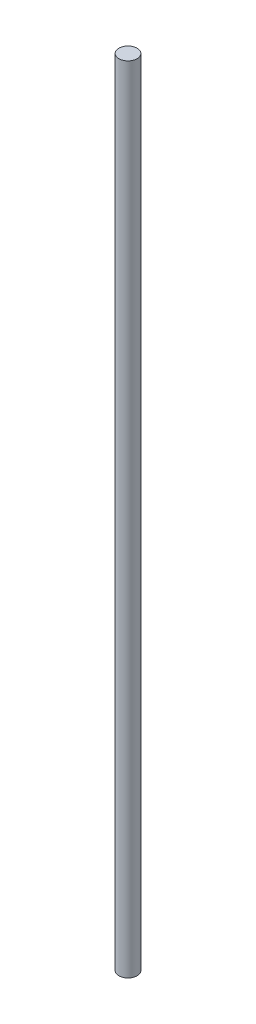
ISO-10303-21;
HEADER;
FILE_DESCRIPTION(('STEP AP214'),'2;1');
FILE_NAME('part.step','',(''),(''),'','','');
FILE_SCHEMA(('AUTOMOTIVE_DESIGN { 1 0 10303 214 1 1 1 1 }'));
ENDSEC;
DATA;
#1=APPLICATION_CONTEXT('core data for automotive mechanical design processes');
#2=APPLICATION_PROTOCOL_DEFINITION('international standard','automotive_design',2000,#1);
#3=PRODUCT_CONTEXT('',#1,'mechanical');
#4=PRODUCT('Part','Part','',(#3));
#5=PRODUCT_RELATED_PRODUCT_CATEGORY('part','',(#4));
#6=PRODUCT_DEFINITION_FORMATION('','',#4);
#7=PRODUCT_DEFINITION_CONTEXT('part definition',#1,'design');
#8=PRODUCT_DEFINITION('design','',#6,#7);
#9=PRODUCT_DEFINITION_SHAPE('','',#8);
#10=(LENGTH_UNIT() NAMED_UNIT(*) SI_UNIT(.MILLI.,.METRE.));
#11=(NAMED_UNIT(*) PLANE_ANGLE_UNIT() SI_UNIT($,.RADIAN.));
#12=(NAMED_UNIT(*) SI_UNIT($,.STERADIAN.) SOLID_ANGLE_UNIT());
#13=UNCERTAINTY_MEASURE_WITH_UNIT(LENGTH_MEASURE(1.E-05),#10,'distance_accuracy_value','');
#14=(GEOMETRIC_REPRESENTATION_CONTEXT(3) GLOBAL_UNCERTAINTY_ASSIGNED_CONTEXT((#13)) GLOBAL_UNIT_ASSIGNED_CONTEXT((#10,
#11,#12)) REPRESENTATION_CONTEXT('',''));
#15=CARTESIAN_POINT('',(0.,0.,0.));
#16=DIRECTION('',(0.,0.,1.));
#17=DIRECTION('',(1.,0.,0.));
#18=AXIS2_PLACEMENT_3D('',#15,#16,#17);
#19=CARTESIAN_POINT('',(0.,523.,0.));
#20=DIRECTION('',(0.,-1.,0.));
#21=DIRECTION('',(0.,0.,-1.));
#22=AXIS2_PLACEMENT_3D('',#19,#20,#21);
#23=CYLINDRICAL_SURFACE('',#22,6.);
#24=CARTESIAN_POINT('',(0.,523.,0.));
#25=DIRECTION('',(0.,1.,0.));
#26=DIRECTION('',(0.,0.,1.));
#27=AXIS2_PLACEMENT_3D('',#24,#25,#26);
#28=CIRCLE('',#27,6.);
#29=CARTESIAN_POINT('',(0.,523.,6.));
#30=VERTEX_POINT('',#29);
#31=EDGE_CURVE('E10',#30,#30,#28,.T.);
#32=ORIENTED_EDGE('',*,*,#31,.F.);
#33=EDGE_LOOP('',(#32));
#34=FACE_BOUND('',#33,.T.);
#35=CARTESIAN_POINT('',(0.,0.,0.));
#36=DIRECTION('',(0.,1.,0.));
#37=DIRECTION('',(0.,0.,1.));
#38=AXIS2_PLACEMENT_3D('',#35,#36,#37);
#39=CIRCLE('',#38,6.);
#40=CARTESIAN_POINT('',(0.,0.,6.));
#41=VERTEX_POINT('',#40);
#42=EDGE_CURVE('E31',#41,#41,#39,.T.);
#43=ORIENTED_EDGE('',*,*,#42,.T.);
#44=EDGE_LOOP('',(#43));
#45=FACE_BOUND('',#44,.T.);
#46=ADVANCED_FACE('F28',(#34,#45),#23,.T.);
#47=CARTESIAN_POINT('',(0.,523.,0.));
#48=DIRECTION('',(0.,1.,0.));
#49=DIRECTION('',(0.,0.,1.));
#50=AXIS2_PLACEMENT_3D('',#47,#48,#49);
#51=PLANE('',#50);
#52=ORIENTED_EDGE('',*,*,#31,.T.);
#53=EDGE_LOOP('',(#52));
#54=FACE_BOUND('',#53,.T.);
#55=ADVANCED_FACE('F43',(#54),#51,.T.);
#56=CARTESIAN_POINT('',(0.,0.,0.));
#57=DIRECTION('',(0.,1.,0.));
#58=DIRECTION('',(0.,0.,1.));
#59=AXIS2_PLACEMENT_3D('',#56,#57,#58);
#60=PLANE('',#59);
#61=ORIENTED_EDGE('',*,*,#42,.F.);
#62=EDGE_LOOP('',(#61));
#63=FACE_BOUND('',#62,.T.);
#64=ADVANCED_FACE('F41',(#63),#60,.F.);
#65=CLOSED_SHELL('',(#46,#55,#64));
#66=MANIFOLD_SOLID_BREP('B2',#65);
#67=ADVANCED_BREP_SHAPE_REPRESENTATION('',(#18,#66),#14);
#68=SHAPE_DEFINITION_REPRESENTATION(#9,#67);
ENDSEC;
END-ISO-10303-21;
